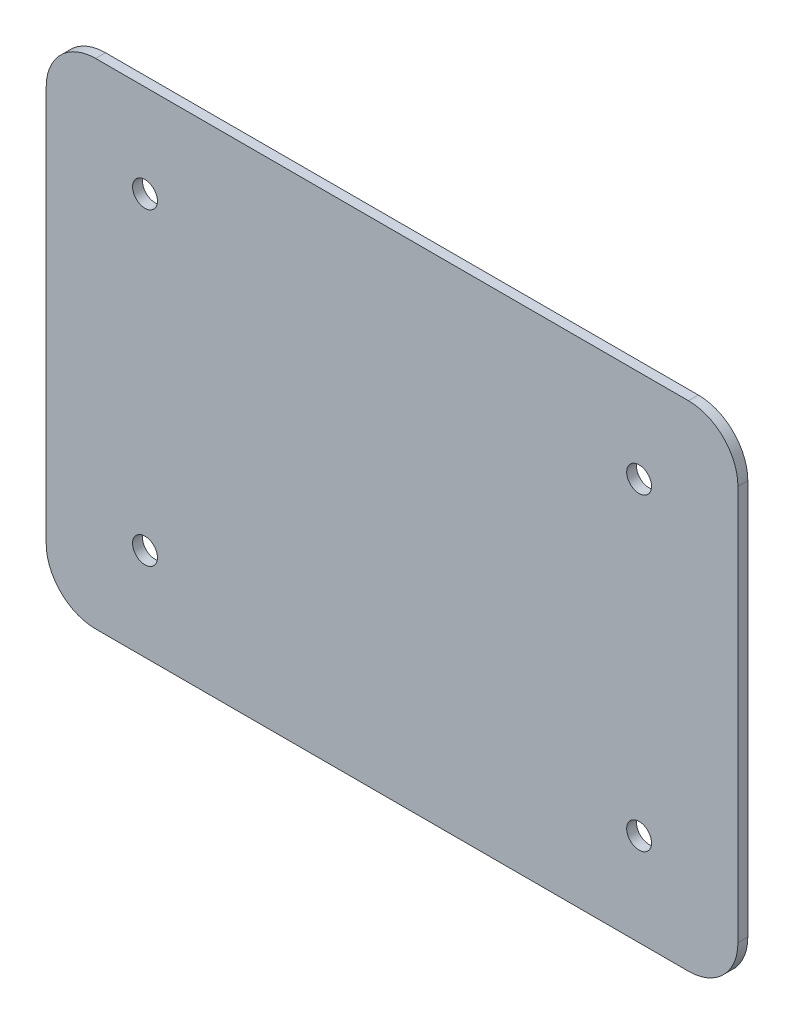
ISO-10303-21;
HEADER;
FILE_DESCRIPTION(('STEP AP214'),'2;1');
FILE_NAME('part.step','',(''),(''),'','','');
FILE_SCHEMA(('AUTOMOTIVE_DESIGN { 1 0 10303 214 1 1 1 1 }'));
ENDSEC;
DATA;
#1=APPLICATION_CONTEXT('core data for automotive mechanical design processes');
#2=APPLICATION_PROTOCOL_DEFINITION('international standard','automotive_design',2000,#1);
#3=PRODUCT_CONTEXT('',#1,'mechanical');
#4=PRODUCT('Part','Part','',(#3));
#5=PRODUCT_RELATED_PRODUCT_CATEGORY('part','',(#4));
#6=PRODUCT_DEFINITION_FORMATION('','',#4);
#7=PRODUCT_DEFINITION_CONTEXT('part definition',#1,'design');
#8=PRODUCT_DEFINITION('design','',#6,#7);
#9=PRODUCT_DEFINITION_SHAPE('','',#8);
#10=(LENGTH_UNIT() NAMED_UNIT(*) SI_UNIT(.MILLI.,.METRE.));
#11=(NAMED_UNIT(*) PLANE_ANGLE_UNIT() SI_UNIT($,.RADIAN.));
#12=(NAMED_UNIT(*) SI_UNIT($,.STERADIAN.) SOLID_ANGLE_UNIT());
#13=UNCERTAINTY_MEASURE_WITH_UNIT(LENGTH_MEASURE(1.E-05),#10,'distance_accuracy_value','');
#14=(GEOMETRIC_REPRESENTATION_CONTEXT(3) GLOBAL_UNCERTAINTY_ASSIGNED_CONTEXT((#13)) GLOBAL_UNIT_ASSIGNED_CONTEXT((#10,
#11,#12)) REPRESENTATION_CONTEXT('',''));
#15=CARTESIAN_POINT('',(0.,0.,0.));
#16=DIRECTION('',(0.,0.,1.));
#17=DIRECTION('',(1.,0.,0.));
#18=AXIS2_PLACEMENT_3D('',#15,#16,#17);
#19=CARTESIAN_POINT('',(70.,-50.,2.));
#20=DIRECTION('',(-1.,0.,0.));
#21=DIRECTION('',(0.,0.,1.));
#22=AXIS2_PLACEMENT_3D('',#19,#20,#21);
#23=PLANE('',#22);
#24=DIRECTION('',(0.,1.,0.));
#25=VECTOR('',#24,1.);
#26=CARTESIAN_POINT('',(70.,-50.,2.));
#27=LINE('',#26,#25);
#28=CARTESIAN_POINT('',(70.,-40.,2.));
#29=VERTEX_POINT('',#28);
#30=CARTESIAN_POINT('',(70.,40.,2.));
#31=VERTEX_POINT('',#30);
#32=EDGE_CURVE('E123',#29,#31,#27,.T.);
#33=ORIENTED_EDGE('',*,*,#32,.F.);
#34=DIRECTION('',(0.,0.,-1.));
#35=VECTOR('',#34,1.);
#36=CARTESIAN_POINT('',(70.,-40.,2.));
#37=LINE('',#36,#35);
#38=CARTESIAN_POINT('',(70.,-40.,0.));
#39=VERTEX_POINT('',#38);
#40=EDGE_CURVE('E108',#29,#39,#37,.T.);
#41=ORIENTED_EDGE('',*,*,#40,.T.);
#42=DIRECTION('',(0.,1.,0.));
#43=VECTOR('',#42,1.);
#44=CARTESIAN_POINT('',(70.,-50.,0.));
#45=LINE('',#44,#43);
#46=CARTESIAN_POINT('',(70.,40.,0.));
#47=VERTEX_POINT('',#46);
#48=EDGE_CURVE('E120',#39,#47,#45,.T.);
#49=ORIENTED_EDGE('',*,*,#48,.T.);
#50=DIRECTION('',(0.,0.,-1.));
#51=VECTOR('',#50,1.);
#52=CARTESIAN_POINT('',(70.,40.,2.));
#53=LINE('',#52,#51);
#54=EDGE_CURVE('E125',#47,#31,#53,.F.);
#55=ORIENTED_EDGE('',*,*,#54,.T.);
#56=EDGE_LOOP('',(#33,#41,#49,#55));
#57=FACE_BOUND('',#56,.T.);
#58=ADVANCED_FACE('F39',(#57),#23,.F.);
#59=CARTESIAN_POINT('',(-70.,50.,2.));
#60=DIRECTION('',(0.,-1.,0.));
#61=DIRECTION('',(0.,0.,-1.));
#62=AXIS2_PLACEMENT_3D('',#59,#60,#61);
#63=PLANE('',#62);
#64=DIRECTION('',(-1.,0.,0.));
#65=VECTOR('',#64,1.);
#66=CARTESIAN_POINT('',(-70.,50.,2.));
#67=LINE('',#66,#65);
#68=CARTESIAN_POINT('',(60.,50.,2.));
#69=VERTEX_POINT('',#68);
#70=CARTESIAN_POINT('',(-60.,50.,2.));
#71=VERTEX_POINT('',#70);
#72=EDGE_CURVE('E178',#69,#71,#67,.T.);
#73=ORIENTED_EDGE('',*,*,#72,.F.);
#74=DIRECTION('',(0.,0.,-1.));
#75=VECTOR('',#74,1.);
#76=CARTESIAN_POINT('',(60.,50.,2.));
#77=LINE('',#76,#75);
#78=CARTESIAN_POINT('',(60.,50.,0.));
#79=VERTEX_POINT('',#78);
#80=EDGE_CURVE('E162',#69,#79,#77,.T.);
#81=ORIENTED_EDGE('',*,*,#80,.T.);
#82=DIRECTION('',(-1.,0.,0.));
#83=VECTOR('',#82,1.);
#84=CARTESIAN_POINT('',(-70.,50.,0.));
#85=LINE('',#84,#83);
#86=CARTESIAN_POINT('',(-60.,50.,0.));
#87=VERTEX_POINT('',#86);
#88=EDGE_CURVE('E129',#79,#87,#85,.T.);
#89=ORIENTED_EDGE('',*,*,#88,.T.);
#90=DIRECTION('',(0.,0.,-1.));
#91=VECTOR('',#90,1.);
#92=CARTESIAN_POINT('',(-60.,50.,2.));
#93=LINE('',#92,#91);
#94=EDGE_CURVE('E160',#87,#71,#93,.F.);
#95=ORIENTED_EDGE('',*,*,#94,.T.);
#96=EDGE_LOOP('',(#73,#81,#89,#95));
#97=FACE_BOUND('',#96,.T.);
#98=ADVANCED_FACE('F236',(#97),#63,.F.);
#99=CARTESIAN_POINT('',(-70.,-50.,2.));
#100=DIRECTION('',(1.,0.,0.));
#101=DIRECTION('',(0.,0.,-1.));
#102=AXIS2_PLACEMENT_3D('',#99,#100,#101);
#103=PLANE('',#102);
#104=DIRECTION('',(0.,-1.,0.));
#105=VECTOR('',#104,1.);
#106=CARTESIAN_POINT('',(-70.,-50.,0.));
#107=LINE('',#106,#105);
#108=CARTESIAN_POINT('',(-70.,40.,0.));
#109=VERTEX_POINT('',#108);
#110=CARTESIAN_POINT('',(-70.,-40.,0.));
#111=VERTEX_POINT('',#110);
#112=EDGE_CURVE('E133',#109,#111,#107,.T.);
#113=ORIENTED_EDGE('',*,*,#112,.T.);
#114=DIRECTION('',(0.,0.,-1.));
#115=VECTOR('',#114,1.);
#116=CARTESIAN_POINT('',(-70.,-40.,2.));
#117=LINE('',#116,#115);
#118=CARTESIAN_POINT('',(-70.,-40.,2.));
#119=VERTEX_POINT('',#118);
#120=EDGE_CURVE('E11',#111,#119,#117,.F.);
#121=ORIENTED_EDGE('',*,*,#120,.T.);
#122=DIRECTION('',(0.,-1.,0.));
#123=VECTOR('',#122,1.);
#124=CARTESIAN_POINT('',(-70.,-50.,2.));
#125=LINE('',#124,#123);
#126=CARTESIAN_POINT('',(-70.,40.,2.));
#127=VERTEX_POINT('',#126);
#128=EDGE_CURVE('E168',#127,#119,#125,.T.);
#129=ORIENTED_EDGE('',*,*,#128,.F.);
#130=DIRECTION('',(0.,0.,-1.));
#131=VECTOR('',#130,1.);
#132=CARTESIAN_POINT('',(-70.,40.,2.));
#133=LINE('',#132,#131);
#134=EDGE_CURVE('E47',#127,#109,#133,.T.);
#135=ORIENTED_EDGE('',*,*,#134,.T.);
#136=EDGE_LOOP('',(#113,#121,#129,#135));
#137=FACE_BOUND('',#136,.T.);
#138=ADVANCED_FACE('F167',(#137),#103,.F.);
#139=CARTESIAN_POINT('',(-70.,-50.,2.));
#140=DIRECTION('',(0.,1.,0.));
#141=DIRECTION('',(0.,0.,1.));
#142=AXIS2_PLACEMENT_3D('',#139,#140,#141);
#143=PLANE('',#142);
#144=DIRECTION('',(1.,0.,0.));
#145=VECTOR('',#144,1.);
#146=CARTESIAN_POINT('',(-70.,-50.,0.));
#147=LINE('',#146,#145);
#148=CARTESIAN_POINT('',(-60.,-50.,0.));
#149=VERTEX_POINT('',#148);
#150=CARTESIAN_POINT('',(60.,-50.,0.));
#151=VERTEX_POINT('',#150);
#152=EDGE_CURVE('E143',#149,#151,#147,.T.);
#153=ORIENTED_EDGE('',*,*,#152,.T.);
#154=DIRECTION('',(0.,0.,-1.));
#155=VECTOR('',#154,1.);
#156=CARTESIAN_POINT('',(60.,-50.,2.));
#157=LINE('',#156,#155);
#158=CARTESIAN_POINT('',(60.,-50.,2.));
#159=VERTEX_POINT('',#158);
#160=EDGE_CURVE('E109',#151,#159,#157,.F.);
#161=ORIENTED_EDGE('',*,*,#160,.T.);
#162=DIRECTION('',(1.,0.,0.));
#163=VECTOR('',#162,1.);
#164=CARTESIAN_POINT('',(-70.,-50.,2.));
#165=LINE('',#164,#163);
#166=CARTESIAN_POINT('',(-60.,-50.,2.));
#167=VERTEX_POINT('',#166);
#168=EDGE_CURVE('E139',#167,#159,#165,.T.);
#169=ORIENTED_EDGE('',*,*,#168,.F.);
#170=DIRECTION('',(0.,0.,-1.));
#171=VECTOR('',#170,1.);
#172=CARTESIAN_POINT('',(-60.,-50.,2.));
#173=LINE('',#172,#171);
#174=EDGE_CURVE('E114',#167,#149,#173,.T.);
#175=ORIENTED_EDGE('',*,*,#174,.T.);
#176=EDGE_LOOP('',(#153,#161,#169,#175));
#177=FACE_BOUND('',#176,.T.);
#178=ADVANCED_FACE('F176',(#177),#143,.F.);
#179=CARTESIAN_POINT('',(0.,0.,2.));
#180=DIRECTION('',(0.,0.,-1.));
#181=DIRECTION('',(-1.,0.,0.));
#182=AXIS2_PLACEMENT_3D('',#179,#180,#181);
#183=PLANE('',#182);
#184=CARTESIAN_POINT('',(50.,-31.25,2.));
#185=DIRECTION('',(0.,0.,-1.));
#186=DIRECTION('',(-1.,0.,0.));
#187=AXIS2_PLACEMENT_3D('',#184,#185,#186);
#188=CIRCLE('',#187,2.515);
#189=CARTESIAN_POINT('',(47.485,-31.25,2.));
#190=VERTEX_POINT('',#189);
#191=EDGE_CURVE('E197',#190,#190,#188,.T.);
#192=ORIENTED_EDGE('',*,*,#191,.T.);
#193=EDGE_LOOP('',(#192));
#194=FACE_BOUND('',#193,.T.);
#195=CARTESIAN_POINT('',(-50.,-31.25,2.));
#196=DIRECTION('',(0.,0.,-1.));
#197=DIRECTION('',(-1.,0.,0.));
#198=AXIS2_PLACEMENT_3D('',#195,#196,#197);
#199=CIRCLE('',#198,2.515);
#200=CARTESIAN_POINT('',(-52.515,-31.25,2.));
#201=VERTEX_POINT('',#200);
#202=EDGE_CURVE('E190',#201,#201,#199,.F.);
#203=ORIENTED_EDGE('',*,*,#202,.F.);
#204=EDGE_LOOP('',(#203));
#205=FACE_BOUND('',#204,.T.);
#206=CARTESIAN_POINT('',(50.,31.25,2.));
#207=DIRECTION('',(0.,0.,-1.));
#208=DIRECTION('',(-1.,0.,0.));
#209=AXIS2_PLACEMENT_3D('',#206,#207,#208);
#210=CIRCLE('',#209,2.515);
#211=CARTESIAN_POINT('',(47.485,31.25,2.));
#212=VERTEX_POINT('',#211);
#213=EDGE_CURVE('E183',#212,#212,#210,.F.);
#214=ORIENTED_EDGE('',*,*,#213,.F.);
#215=EDGE_LOOP('',(#214));
#216=FACE_BOUND('',#215,.T.);
#217=CARTESIAN_POINT('',(-50.,31.25,2.));
#218=DIRECTION('',(0.,0.,-1.));
#219=DIRECTION('',(-1.,0.,0.));
#220=AXIS2_PLACEMENT_3D('',#217,#218,#219);
#221=CIRCLE('',#220,2.515);
#222=CARTESIAN_POINT('',(-52.515,31.25,2.));
#223=VERTEX_POINT('',#222);
#224=EDGE_CURVE('E136',#223,#223,#221,.T.);
#225=ORIENTED_EDGE('',*,*,#224,.T.);
#226=EDGE_LOOP('',(#225));
#227=FACE_BOUND('',#226,.T.);
#228=ORIENTED_EDGE('',*,*,#168,.T.);
#229=CARTESIAN_POINT('',(60.,-40.,2.));
#230=DIRECTION('',(0.,0.,-1.));
#231=DIRECTION('',(-1.,0.,0.));
#232=AXIS2_PLACEMENT_3D('',#229,#230,#231);
#233=CIRCLE('',#232,10.);
#234=EDGE_CURVE('E158',#159,#29,#233,.F.);
#235=ORIENTED_EDGE('',*,*,#234,.T.);
#236=ORIENTED_EDGE('',*,*,#32,.T.);
#237=CARTESIAN_POINT('',(60.,40.,2.));
#238=DIRECTION('',(0.,0.,-1.));
#239=DIRECTION('',(-1.,0.,0.));
#240=AXIS2_PLACEMENT_3D('',#237,#238,#239);
#241=CIRCLE('',#240,10.);
#242=EDGE_CURVE('E156',#31,#69,#241,.F.);
#243=ORIENTED_EDGE('',*,*,#242,.T.);
#244=ORIENTED_EDGE('',*,*,#72,.T.);
#245=CARTESIAN_POINT('',(-60.,40.,2.));
#246=DIRECTION('',(0.,0.,-1.));
#247=DIRECTION('',(-1.,0.,0.));
#248=AXIS2_PLACEMENT_3D('',#245,#246,#247);
#249=CIRCLE('',#248,10.);
#250=EDGE_CURVE('E59',#71,#127,#249,.F.);
#251=ORIENTED_EDGE('',*,*,#250,.T.);
#252=ORIENTED_EDGE('',*,*,#128,.T.);
#253=CARTESIAN_POINT('',(-60.,-40.,2.));
#254=DIRECTION('',(0.,0.,-1.));
#255=DIRECTION('',(-1.,0.,0.));
#256=AXIS2_PLACEMENT_3D('',#253,#254,#255);
#257=CIRCLE('',#256,10.);
#258=EDGE_CURVE('E154',#119,#167,#257,.F.);
#259=ORIENTED_EDGE('',*,*,#258,.T.);
#260=EDGE_LOOP('',(#228,#235,#236,#243,#244,#251,#252,#259));
#261=FACE_BOUND('',#260,.T.);
#262=ADVANCED_FACE('F212',(#194,#205,#216,#227,#261),#183,.F.);
#263=CARTESIAN_POINT('',(0.,0.,0.));
#264=DIRECTION('',(0.,0.,-1.));
#265=DIRECTION('',(-1.,0.,0.));
#266=AXIS2_PLACEMENT_3D('',#263,#264,#265);
#267=PLANE('',#266);
#268=CARTESIAN_POINT('',(50.,-31.25,0.));
#269=DIRECTION('',(0.,0.,1.));
#270=DIRECTION('',(-1.,0.,0.));
#271=AXIS2_PLACEMENT_3D('',#268,#269,#270);
#272=CIRCLE('',#271,2.515);
#273=CARTESIAN_POINT('',(47.485,-31.25,0.));
#274=VERTEX_POINT('',#273);
#275=EDGE_CURVE('E196',#274,#274,#272,.T.);
#276=ORIENTED_EDGE('',*,*,#275,.T.);
#277=EDGE_LOOP('',(#276));
#278=FACE_BOUND('',#277,.T.);
#279=CARTESIAN_POINT('',(-50.,-31.25,0.));
#280=DIRECTION('',(0.,0.,-1.));
#281=DIRECTION('',(1.,0.,0.));
#282=AXIS2_PLACEMENT_3D('',#279,#280,#281);
#283=CIRCLE('',#282,2.515);
#284=CARTESIAN_POINT('',(-47.485,-31.25,0.));
#285=VERTEX_POINT('',#284);
#286=EDGE_CURVE('E193',#285,#285,#283,.T.);
#287=ORIENTED_EDGE('',*,*,#286,.F.);
#288=EDGE_LOOP('',(#287));
#289=FACE_BOUND('',#288,.T.);
#290=CARTESIAN_POINT('',(50.,31.25,0.));
#291=DIRECTION('',(0.,0.,-1.));
#292=DIRECTION('',(-1.,0.,0.));
#293=AXIS2_PLACEMENT_3D('',#290,#291,#292);
#294=CIRCLE('',#293,2.515);
#295=CARTESIAN_POINT('',(47.485,31.25,0.));
#296=VERTEX_POINT('',#295);
#297=EDGE_CURVE('E187',#296,#296,#294,.T.);
#298=ORIENTED_EDGE('',*,*,#297,.F.);
#299=EDGE_LOOP('',(#298));
#300=FACE_BOUND('',#299,.T.);
#301=CARTESIAN_POINT('',(-50.,31.25,0.));
#302=DIRECTION('',(0.,0.,1.));
#303=DIRECTION('',(1.,0.,0.));
#304=AXIS2_PLACEMENT_3D('',#301,#302,#303);
#305=CIRCLE('',#304,2.515);
#306=CARTESIAN_POINT('',(-47.485,31.25,0.));
#307=VERTEX_POINT('',#306);
#308=EDGE_CURVE('E130',#307,#307,#305,.T.);
#309=ORIENTED_EDGE('',*,*,#308,.T.);
#310=EDGE_LOOP('',(#309));
#311=FACE_BOUND('',#310,.T.);
#312=ORIENTED_EDGE('',*,*,#48,.F.);
#313=CARTESIAN_POINT('',(60.,-40.,0.));
#314=DIRECTION('',(0.,0.,-1.));
#315=DIRECTION('',(-1.,0.,0.));
#316=AXIS2_PLACEMENT_3D('',#313,#314,#315);
#317=CIRCLE('',#316,10.);
#318=EDGE_CURVE('E104',#39,#151,#317,.T.);
#319=ORIENTED_EDGE('',*,*,#318,.T.);
#320=ORIENTED_EDGE('',*,*,#152,.F.);
#321=CARTESIAN_POINT('',(-60.,-40.,0.));
#322=DIRECTION('',(0.,0.,-1.));
#323=DIRECTION('',(-1.,0.,0.));
#324=AXIS2_PLACEMENT_3D('',#321,#322,#323);
#325=CIRCLE('',#324,10.);
#326=EDGE_CURVE('E147',#149,#111,#325,.T.);
#327=ORIENTED_EDGE('',*,*,#326,.T.);
#328=ORIENTED_EDGE('',*,*,#112,.F.);
#329=CARTESIAN_POINT('',(-60.,40.,0.));
#330=DIRECTION('',(0.,0.,-1.));
#331=DIRECTION('',(-1.,0.,0.));
#332=AXIS2_PLACEMENT_3D('',#329,#330,#331);
#333=CIRCLE('',#332,10.);
#334=EDGE_CURVE('E124',#109,#87,#333,.T.);
#335=ORIENTED_EDGE('',*,*,#334,.T.);
#336=ORIENTED_EDGE('',*,*,#88,.F.);
#337=CARTESIAN_POINT('',(60.,40.,0.));
#338=DIRECTION('',(0.,0.,-1.));
#339=DIRECTION('',(-1.,0.,0.));
#340=AXIS2_PLACEMENT_3D('',#337,#338,#339);
#341=CIRCLE('',#340,10.);
#342=EDGE_CURVE('E115',#79,#47,#341,.T.);
#343=ORIENTED_EDGE('',*,*,#342,.T.);
#344=EDGE_LOOP('',(#312,#319,#320,#327,#328,#335,#336,#343));
#345=FACE_BOUND('',#344,.T.);
#346=ADVANCED_FACE('F127',(#278,#289,#300,#311,#345),#267,.T.);
#347=CARTESIAN_POINT('',(-50.,31.25,2.001));
#348=DIRECTION('',(0.,0.,-1.));
#349=DIRECTION('',(-1.,0.,0.));
#350=AXIS2_PLACEMENT_3D('',#347,#348,#349);
#351=CYLINDRICAL_SURFACE('',#350,2.515);
#352=ORIENTED_EDGE('',*,*,#308,.F.);
#353=EDGE_LOOP('',(#352));
#354=FACE_BOUND('',#353,.T.);
#355=ORIENTED_EDGE('',*,*,#224,.F.);
#356=EDGE_LOOP('',(#355));
#357=FACE_BOUND('',#356,.T.);
#358=ADVANCED_FACE('F222',(#354,#357),#351,.F.);
#359=CARTESIAN_POINT('',(60.,-40.,2.));
#360=DIRECTION('',(0.,0.,-1.));
#361=DIRECTION('',(-1.,0.,0.));
#362=AXIS2_PLACEMENT_3D('',#359,#360,#361);
#363=CYLINDRICAL_SURFACE('',#362,10.);
#364=ORIENTED_EDGE('',*,*,#234,.F.);
#365=ORIENTED_EDGE('',*,*,#160,.F.);
#366=ORIENTED_EDGE('',*,*,#318,.F.);
#367=ORIENTED_EDGE('',*,*,#40,.F.);
#368=EDGE_LOOP('',(#364,#365,#366,#367));
#369=FACE_BOUND('',#368,.T.);
#370=ADVANCED_FACE('F107',(#369),#363,.T.);
#371=CARTESIAN_POINT('',(60.,40.,2.));
#372=DIRECTION('',(0.,0.,-1.));
#373=DIRECTION('',(-1.,0.,0.));
#374=AXIS2_PLACEMENT_3D('',#371,#372,#373);
#375=CYLINDRICAL_SURFACE('',#374,10.);
#376=ORIENTED_EDGE('',*,*,#242,.F.);
#377=ORIENTED_EDGE('',*,*,#54,.F.);
#378=ORIENTED_EDGE('',*,*,#342,.F.);
#379=ORIENTED_EDGE('',*,*,#80,.F.);
#380=EDGE_LOOP('',(#376,#377,#378,#379));
#381=FACE_BOUND('',#380,.T.);
#382=ADVANCED_FACE('F230',(#381),#375,.T.);
#383=CARTESIAN_POINT('',(-60.,-40.,2.));
#384=DIRECTION('',(0.,0.,-1.));
#385=DIRECTION('',(-1.,0.,0.));
#386=AXIS2_PLACEMENT_3D('',#383,#384,#385);
#387=CYLINDRICAL_SURFACE('',#386,10.);
#388=ORIENTED_EDGE('',*,*,#258,.F.);
#389=ORIENTED_EDGE('',*,*,#120,.F.);
#390=ORIENTED_EDGE('',*,*,#326,.F.);
#391=ORIENTED_EDGE('',*,*,#174,.F.);
#392=EDGE_LOOP('',(#388,#389,#390,#391));
#393=FACE_BOUND('',#392,.T.);
#394=ADVANCED_FACE('F173',(#393),#387,.T.);
#395=CARTESIAN_POINT('',(-60.,40.,2.));
#396=DIRECTION('',(0.,0.,-1.));
#397=DIRECTION('',(-1.,0.,0.));
#398=AXIS2_PLACEMENT_3D('',#395,#396,#397);
#399=CYLINDRICAL_SURFACE('',#398,10.);
#400=ORIENTED_EDGE('',*,*,#250,.F.);
#401=ORIENTED_EDGE('',*,*,#94,.F.);
#402=ORIENTED_EDGE('',*,*,#334,.F.);
#403=ORIENTED_EDGE('',*,*,#134,.F.);
#404=EDGE_LOOP('',(#400,#401,#402,#403));
#405=FACE_BOUND('',#404,.T.);
#406=ADVANCED_FACE('F41',(#405),#399,.T.);
#407=CARTESIAN_POINT('',(50.,31.25,2.001));
#408=DIRECTION('',(0.,0.,-1.));
#409=DIRECTION('',(-1.,0.,0.));
#410=AXIS2_PLACEMENT_3D('',#407,#408,#409);
#411=CYLINDRICAL_SURFACE('',#410,2.515);
#412=ORIENTED_EDGE('',*,*,#297,.T.);
#413=EDGE_LOOP('',(#412));
#414=FACE_BOUND('',#413,.T.);
#415=ORIENTED_EDGE('',*,*,#213,.T.);
#416=EDGE_LOOP('',(#415));
#417=FACE_BOUND('',#416,.T.);
#418=ADVANCED_FACE('F251',(#414,#417),#411,.F.);
#419=CARTESIAN_POINT('',(-50.,-31.25,2.001));
#420=DIRECTION('',(0.,0.,-1.));
#421=DIRECTION('',(-1.,0.,0.));
#422=AXIS2_PLACEMENT_3D('',#419,#420,#421);
#423=CYLINDRICAL_SURFACE('',#422,2.515);
#424=ORIENTED_EDGE('',*,*,#286,.T.);
#425=EDGE_LOOP('',(#424));
#426=FACE_BOUND('',#425,.T.);
#427=ORIENTED_EDGE('',*,*,#202,.T.);
#428=EDGE_LOOP('',(#427));
#429=FACE_BOUND('',#428,.T.);
#430=ADVANCED_FACE('F208',(#426,#429),#423,.F.);
#431=CARTESIAN_POINT('',(50.,-31.25,2.001));
#432=DIRECTION('',(0.,0.,-1.));
#433=DIRECTION('',(-1.,0.,0.));
#434=AXIS2_PLACEMENT_3D('',#431,#432,#433);
#435=CYLINDRICAL_SURFACE('',#434,2.515);
#436=ORIENTED_EDGE('',*,*,#275,.F.);
#437=EDGE_LOOP('',(#436));
#438=FACE_BOUND('',#437,.T.);
#439=ORIENTED_EDGE('',*,*,#191,.F.);
#440=EDGE_LOOP('',(#439));
#441=FACE_BOUND('',#440,.T.);
#442=ADVANCED_FACE('F205',(#438,#441),#435,.F.);
#443=CLOSED_SHELL('',(#58,#98,#138,#178,#262,#346,#358,#370,#382,#394,#406,#418,#430,#442));
#444=MANIFOLD_SOLID_BREP('B2',#443);
#445=ADVANCED_BREP_SHAPE_REPRESENTATION('',(#18,#444),#14);
#446=SHAPE_DEFINITION_REPRESENTATION(#9,#445);
ENDSEC;
END-ISO-10303-21;
